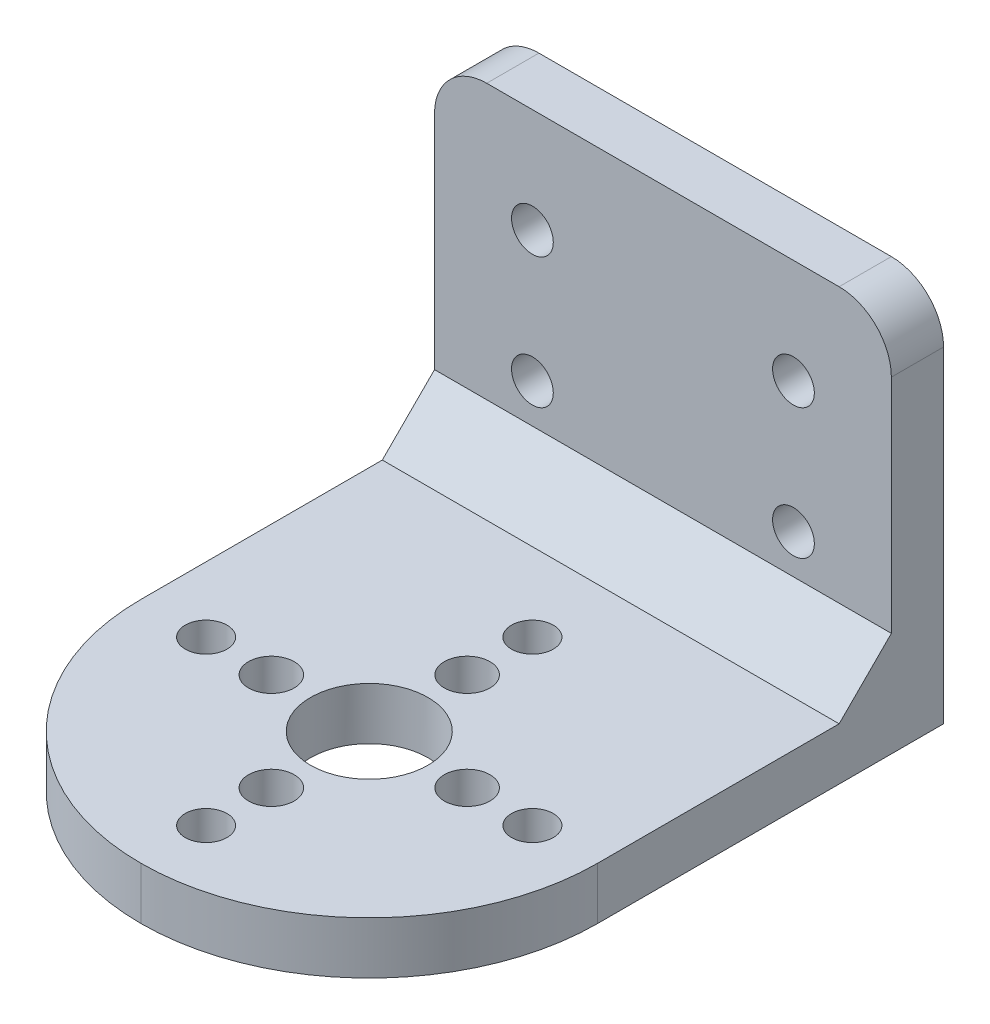
ISO-10303-21;
HEADER;
FILE_DESCRIPTION(('STEP AP214'),'2;1');
FILE_NAME('part.step','',(''),(''),'','','');
FILE_SCHEMA(('AUTOMOTIVE_DESIGN { 1 0 10303 214 1 1 1 1 }'));
ENDSEC;
DATA;
#1=APPLICATION_CONTEXT('core data for automotive mechanical design processes');
#2=APPLICATION_PROTOCOL_DEFINITION('international standard','automotive_design',2000,#1);
#3=PRODUCT_CONTEXT('',#1,'mechanical');
#4=PRODUCT('Part','Part','',(#3));
#5=PRODUCT_RELATED_PRODUCT_CATEGORY('part','',(#4));
#6=PRODUCT_DEFINITION_FORMATION('','',#4);
#7=PRODUCT_DEFINITION_CONTEXT('part definition',#1,'design');
#8=PRODUCT_DEFINITION('design','',#6,#7);
#9=PRODUCT_DEFINITION_SHAPE('','',#8);
#10=(LENGTH_UNIT() NAMED_UNIT(*) SI_UNIT(.MILLI.,.METRE.));
#11=(NAMED_UNIT(*) PLANE_ANGLE_UNIT() SI_UNIT($,.RADIAN.));
#12=(NAMED_UNIT(*) SI_UNIT($,.STERADIAN.) SOLID_ANGLE_UNIT());
#13=UNCERTAINTY_MEASURE_WITH_UNIT(LENGTH_MEASURE(1.E-05),#10,'distance_accuracy_value','');
#14=(GEOMETRIC_REPRESENTATION_CONTEXT(3) GLOBAL_UNCERTAINTY_ASSIGNED_CONTEXT((#13)) GLOBAL_UNIT_ASSIGNED_CONTEXT((#10,
#11,#12)) REPRESENTATION_CONTEXT('',''));
#15=CARTESIAN_POINT('',(0.,0.,0.));
#16=DIRECTION('',(0.,0.,1.));
#17=DIRECTION('',(1.,0.,0.));
#18=AXIS2_PLACEMENT_3D('',#15,#16,#17);
#19=CARTESIAN_POINT('',(0.,4.,0.));
#20=DIRECTION('',(0.,-1.,0.));
#21=DIRECTION('',(0.,0.,-1.));
#22=AXIS2_PLACEMENT_3D('',#19,#20,#21);
#23=PLANE('',#22);
#24=CARTESIAN_POINT('',(17.5,4.,-10.));
#25=DIRECTION('',(0.,1.,0.));
#26=DIRECTION('',(0.,0.,1.));
#27=AXIS2_PLACEMENT_3D('',#24,#25,#26);
#28=CIRCLE('',#27,1.75);
#29=CARTESIAN_POINT('',(17.5,4.,-8.25));
#30=VERTEX_POINT('',#29);
#31=EDGE_CURVE('E348',#30,#30,#28,.T.);
#32=ORIENTED_EDGE('',*,*,#31,.F.);
#33=EDGE_LOOP('',(#32));
#34=FACE_BOUND('',#33,.T.);
#35=CARTESIAN_POINT('',(10.,4.,-17.5));
#36=DIRECTION('',(0.,1.,0.));
#37=DIRECTION('',(0.,0.,1.));
#38=AXIS2_PLACEMENT_3D('',#35,#36,#37);
#39=CIRCLE('',#38,1.75);
#40=CARTESIAN_POINT('',(10.,4.,-15.75));
#41=VERTEX_POINT('',#40);
#42=EDGE_CURVE('E344',#41,#41,#39,.T.);
#43=ORIENTED_EDGE('',*,*,#42,.F.);
#44=EDGE_LOOP('',(#43));
#45=FACE_BOUND('',#44,.T.);
#46=CARTESIAN_POINT('',(25.,4.,-17.5));
#47=DIRECTION('',(0.,1.,0.));
#48=DIRECTION('',(0.,0.,1.));
#49=AXIS2_PLACEMENT_3D('',#46,#47,#48);
#50=CIRCLE('',#49,1.75);
#51=CARTESIAN_POINT('',(25.,4.,-15.75));
#52=VERTEX_POINT('',#51);
#53=EDGE_CURVE('E340',#52,#52,#50,.T.);
#54=ORIENTED_EDGE('',*,*,#53,.F.);
#55=EDGE_LOOP('',(#54));
#56=FACE_BOUND('',#55,.T.);
#57=CARTESIAN_POINT('',(17.5,4.,-25.));
#58=DIRECTION('',(0.,1.,0.));
#59=DIRECTION('',(0.,0.,1.));
#60=AXIS2_PLACEMENT_3D('',#57,#58,#59);
#61=CIRCLE('',#60,1.75);
#62=CARTESIAN_POINT('',(17.5,4.,-23.25));
#63=VERTEX_POINT('',#62);
#64=EDGE_CURVE('E339',#63,#63,#61,.T.);
#65=ORIENTED_EDGE('',*,*,#64,.F.);
#66=EDGE_LOOP('',(#65));
#67=FACE_BOUND('',#66,.T.);
#68=CARTESIAN_POINT('',(5.,4.,-17.5));
#69=DIRECTION('',(0.,1.,0.));
#70=DIRECTION('',(0.,0.,1.));
#71=AXIS2_PLACEMENT_3D('',#68,#69,#70);
#72=CIRCLE('',#71,1.6);
#73=CARTESIAN_POINT('',(5.,4.,-15.9));
#74=VERTEX_POINT('',#73);
#75=EDGE_CURVE('E364',#74,#74,#72,.T.);
#76=ORIENTED_EDGE('',*,*,#75,.F.);
#77=EDGE_LOOP('',(#76));
#78=FACE_BOUND('',#77,.T.);
#79=CARTESIAN_POINT('',(17.5,4.,-5.));
#80=DIRECTION('',(0.,1.,0.));
#81=DIRECTION('',(0.,0.,1.));
#82=AXIS2_PLACEMENT_3D('',#79,#80,#81);
#83=CIRCLE('',#82,1.6);
#84=CARTESIAN_POINT('',(17.5,4.,-3.4));
#85=VERTEX_POINT('',#84);
#86=EDGE_CURVE('E360',#85,#85,#83,.T.);
#87=ORIENTED_EDGE('',*,*,#86,.F.);
#88=EDGE_LOOP('',(#87));
#89=FACE_BOUND('',#88,.T.);
#90=CARTESIAN_POINT('',(30.,4.,-17.5));
#91=DIRECTION('',(0.,1.,0.));
#92=DIRECTION('',(0.,0.,1.));
#93=AXIS2_PLACEMENT_3D('',#90,#91,#92);
#94=CIRCLE('',#93,1.6);
#95=CARTESIAN_POINT('',(30.,4.,-15.9));
#96=VERTEX_POINT('',#95);
#97=EDGE_CURVE('E356',#96,#96,#94,.T.);
#98=ORIENTED_EDGE('',*,*,#97,.F.);
#99=EDGE_LOOP('',(#98));
#100=FACE_BOUND('',#99,.T.);
#101=CARTESIAN_POINT('',(17.5,4.,-30.));
#102=DIRECTION('',(0.,1.,0.));
#103=DIRECTION('',(0.,0.,1.));
#104=AXIS2_PLACEMENT_3D('',#101,#102,#103);
#105=CIRCLE('',#104,1.6);
#106=CARTESIAN_POINT('',(17.5,4.,-28.4));
#107=VERTEX_POINT('',#106);
#108=EDGE_CURVE('E352',#107,#107,#105,.T.);
#109=ORIENTED_EDGE('',*,*,#108,.F.);
#110=EDGE_LOOP('',(#109));
#111=FACE_BOUND('',#110,.T.);
#112=CARTESIAN_POINT('',(17.5,4.,-17.5));
#113=DIRECTION('',(0.,1.,0.));
#114=DIRECTION('',(0.,0.,1.));
#115=AXIS2_PLACEMENT_3D('',#112,#113,#114);
#116=CIRCLE('',#115,4.5);
#117=CARTESIAN_POINT('',(17.5,4.,-13.));
#118=VERTEX_POINT('',#117);
#119=EDGE_CURVE('E166',#118,#118,#116,.T.);
#120=ORIENTED_EDGE('',*,*,#119,.F.);
#121=EDGE_LOOP('',(#120));
#122=FACE_BOUND('',#121,.T.);
#123=CARTESIAN_POINT('',(17.5,4.,-17.5));
#124=DIRECTION('',(0.,-1.,0.));
#125=DIRECTION('',(0.,0.,-1.));
#126=AXIS2_PLACEMENT_3D('',#123,#124,#125);
#127=CIRCLE('',#126,17.5);
#128=CARTESIAN_POINT('',(0.,4.,-17.5));
#129=VERTEX_POINT('',#128);
#130=CARTESIAN_POINT('',(17.5,4.,0.));
#131=VERTEX_POINT('',#130);
#132=EDGE_CURVE('E221',#129,#131,#127,.F.);
#133=ORIENTED_EDGE('',*,*,#132,.T.);
#134=CARTESIAN_POINT('',(17.5,4.,-17.5));
#135=DIRECTION('',(0.,-1.,0.));
#136=DIRECTION('',(0.,0.,-1.));
#137=AXIS2_PLACEMENT_3D('',#134,#135,#136);
#138=CIRCLE('',#137,17.5);
#139=CARTESIAN_POINT('',(35.,4.,-17.5));
#140=VERTEX_POINT('',#139);
#141=EDGE_CURVE('E224',#131,#140,#138,.F.);
#142=ORIENTED_EDGE('',*,*,#141,.T.);
#143=DIRECTION('',(0.,0.,-1.));
#144=VECTOR('',#143,1.);
#145=CARTESIAN_POINT('',(35.,4.,0.));
#146=LINE('',#145,#144);
#147=CARTESIAN_POINT('',(35.,4.,-36.));
#148=VERTEX_POINT('',#147);
#149=EDGE_CURVE('E155',#140,#148,#146,.T.);
#150=ORIENTED_EDGE('',*,*,#149,.T.);
#151=DIRECTION('',(-1.,0.,0.));
#152=VECTOR('',#151,1.);
#153=CARTESIAN_POINT('',(0.,4.,-36.));
#154=LINE('',#153,#152);
#155=CARTESIAN_POINT('',(0.,4.,-36.));
#156=VERTEX_POINT('',#155);
#157=EDGE_CURVE('E202',#148,#156,#154,.T.);
#158=ORIENTED_EDGE('',*,*,#157,.T.);
#159=DIRECTION('',(0.,0.,1.));
#160=VECTOR('',#159,1.);
#161=CARTESIAN_POINT('',(0.,4.,0.));
#162=LINE('',#161,#160);
#163=EDGE_CURVE('E151',#156,#129,#162,.T.);
#164=ORIENTED_EDGE('',*,*,#163,.T.);
#165=EDGE_LOOP('',(#133,#142,#150,#158,#164));
#166=FACE_BOUND('',#165,.T.);
#167=ADVANCED_FACE('F47',(#34,#45,#56,#67,#78,#89,#100,#111,#122,#166),#23,.F.);
#168=CARTESIAN_POINT('',(0.,4.,0.));
#169=DIRECTION('',(1.,0.,0.));
#170=DIRECTION('',(0.,0.,-1.));
#171=AXIS2_PLACEMENT_3D('',#168,#169,#170);
#172=PLANE('',#171);
#173=DIRECTION('',(0.,-1.,0.));
#174=VECTOR('',#173,1.);
#175=CARTESIAN_POINT('',(0.,29.,-40.));
#176=LINE('',#175,#174);
#177=CARTESIAN_POINT('',(0.,25.,-40.));
#178=VERTEX_POINT('',#177);
#179=CARTESIAN_POINT('',(0.,8.00000000000003,-40.));
#180=VERTEX_POINT('',#179);
#181=EDGE_CURVE('E329',#178,#180,#176,.T.);
#182=ORIENTED_EDGE('',*,*,#181,.F.);
#183=DIRECTION('',(0.,0.,1.));
#184=VECTOR('',#183,1.);
#185=CARTESIAN_POINT('',(0.,25.,-44.));
#186=LINE('',#185,#184);
#187=CARTESIAN_POINT('',(0.,25.,-44.));
#188=VERTEX_POINT('',#187);
#189=EDGE_CURVE('E11',#178,#188,#186,.F.);
#190=ORIENTED_EDGE('',*,*,#189,.T.);
#191=DIRECTION('',(0.,-1.,0.));
#192=VECTOR('',#191,1.);
#193=CARTESIAN_POINT('',(0.,4.,-44.));
#194=LINE('',#193,#192);
#195=CARTESIAN_POINT('',(0.,0.,-44.));
#196=VERTEX_POINT('',#195);
#197=EDGE_CURVE('E135',#188,#196,#194,.T.);
#198=ORIENTED_EDGE('',*,*,#197,.T.);
#199=DIRECTION('',(0.,0.,1.));
#200=VECTOR('',#199,1.);
#201=CARTESIAN_POINT('',(0.,0.,0.));
#202=LINE('',#201,#200);
#203=CARTESIAN_POINT('',(0.,0.,-17.5));
#204=VERTEX_POINT('',#203);
#205=EDGE_CURVE('E146',#196,#204,#202,.T.);
#206=ORIENTED_EDGE('',*,*,#205,.T.);
#207=DIRECTION('',(0.,-1.,0.));
#208=VECTOR('',#207,1.);
#209=CARTESIAN_POINT('',(0.,4.,-17.5));
#210=LINE('',#209,#208);
#211=EDGE_CURVE('E227',#204,#129,#210,.F.);
#212=ORIENTED_EDGE('',*,*,#211,.T.);
#213=ORIENTED_EDGE('',*,*,#163,.F.);
#214=DIRECTION('',(0.,-0.707106781186551,0.707106781186544));
#215=VECTOR('',#214,1.);
#216=CARTESIAN_POINT('',(0.,-14.,-18.0000000000002));
#217=LINE('',#216,#215);
#218=EDGE_CURVE('E209',#156,#180,#217,.F.);
#219=ORIENTED_EDGE('',*,*,#218,.T.);
#220=EDGE_LOOP('',(#182,#190,#198,#206,#212,#213,#219));
#221=FACE_BOUND('',#220,.T.);
#222=ADVANCED_FACE('F279',(#221),#172,.F.);
#223=CARTESIAN_POINT('',(35.,4.,0.));
#224=DIRECTION('',(-1.,0.,0.));
#225=DIRECTION('',(0.,0.,1.));
#226=AXIS2_PLACEMENT_3D('',#223,#224,#225);
#227=PLANE('',#226);
#228=DIRECTION('',(0.,-1.,0.));
#229=VECTOR('',#228,1.);
#230=CARTESIAN_POINT('',(35.,4.,-44.));
#231=LINE('',#230,#229);
#232=CARTESIAN_POINT('',(35.,25.,-44.));
#233=VERTEX_POINT('',#232);
#234=CARTESIAN_POINT('',(35.,0.,-44.));
#235=VERTEX_POINT('',#234);
#236=EDGE_CURVE('E124',#233,#235,#231,.T.);
#237=ORIENTED_EDGE('',*,*,#236,.F.);
#238=DIRECTION('',(0.,0.,-1.));
#239=VECTOR('',#238,1.);
#240=CARTESIAN_POINT('',(35.,25.,-40.));
#241=LINE('',#240,#239);
#242=CARTESIAN_POINT('',(35.,25.,-40.));
#243=VERTEX_POINT('',#242);
#244=EDGE_CURVE('E71',#233,#243,#241,.F.);
#245=ORIENTED_EDGE('',*,*,#244,.T.);
#246=DIRECTION('',(0.,-1.,0.));
#247=VECTOR('',#246,1.);
#248=CARTESIAN_POINT('',(35.,29.,-40.));
#249=LINE('',#248,#247);
#250=CARTESIAN_POINT('',(35.,8.00000000000003,-40.));
#251=VERTEX_POINT('',#250);
#252=EDGE_CURVE('E255',#243,#251,#249,.T.);
#253=ORIENTED_EDGE('',*,*,#252,.T.);
#254=DIRECTION('',(0.,0.707106781186551,-0.707106781186544));
#255=VECTOR('',#254,1.);
#256=CARTESIAN_POINT('',(35.,-14.,-18.0000000000002));
#257=LINE('',#256,#255);
#258=EDGE_CURVE('E205',#251,#148,#257,.F.);
#259=ORIENTED_EDGE('',*,*,#258,.T.);
#260=ORIENTED_EDGE('',*,*,#149,.F.);
#261=DIRECTION('',(0.,-1.,0.));
#262=VECTOR('',#261,1.);
#263=CARTESIAN_POINT('',(35.,4.,-17.5));
#264=LINE('',#263,#262);
#265=CARTESIAN_POINT('',(35.,0.,-17.5));
#266=VERTEX_POINT('',#265);
#267=EDGE_CURVE('E143',#140,#266,#264,.T.);
#268=ORIENTED_EDGE('',*,*,#267,.T.);
#269=DIRECTION('',(0.,0.,-1.));
#270=VECTOR('',#269,1.);
#271=CARTESIAN_POINT('',(35.,0.,0.));
#272=LINE('',#271,#270);
#273=EDGE_CURVE('E139',#266,#235,#272,.T.);
#274=ORIENTED_EDGE('',*,*,#273,.T.);
#275=EDGE_LOOP('',(#237,#245,#253,#259,#260,#268,#274));
#276=FACE_BOUND('',#275,.T.);
#277=ADVANCED_FACE('F140',(#276),#227,.F.);
#278=CARTESIAN_POINT('',(0.,4.,-44.));
#279=DIRECTION('',(0.,0.,1.));
#280=DIRECTION('',(1.,0.,0.));
#281=AXIS2_PLACEMENT_3D('',#278,#279,#280);
#282=PLANE('',#281);
#283=CARTESIAN_POINT('',(7.5,11.,-44.));
#284=DIRECTION('',(0.,0.,1.));
#285=DIRECTION('',(1.,0.,0.));
#286=AXIS2_PLACEMENT_3D('',#283,#284,#285);
#287=CIRCLE('',#286,1.6);
#288=CARTESIAN_POINT('',(9.1,11.,-44.));
#289=VERTEX_POINT('',#288);
#290=EDGE_CURVE('E368',#289,#289,#287,.T.);
#291=ORIENTED_EDGE('',*,*,#290,.T.);
#292=EDGE_LOOP('',(#291));
#293=FACE_BOUND('',#292,.T.);
#294=CARTESIAN_POINT('',(27.5,11.,-44.));
#295=DIRECTION('',(0.,0.,1.));
#296=DIRECTION('',(1.,0.,0.));
#297=AXIS2_PLACEMENT_3D('',#294,#295,#296);
#298=CIRCLE('',#297,1.6);
#299=CARTESIAN_POINT('',(29.1,11.,-44.));
#300=VERTEX_POINT('',#299);
#301=EDGE_CURVE('E375',#300,#300,#298,.T.);
#302=ORIENTED_EDGE('',*,*,#301,.T.);
#303=EDGE_LOOP('',(#302));
#304=FACE_BOUND('',#303,.T.);
#305=CARTESIAN_POINT('',(27.5,21.,-44.));
#306=DIRECTION('',(0.,0.,1.));
#307=DIRECTION('',(1.,0.,0.));
#308=AXIS2_PLACEMENT_3D('',#305,#306,#307);
#309=CIRCLE('',#308,1.6);
#310=CARTESIAN_POINT('',(29.1,21.,-44.));
#311=VERTEX_POINT('',#310);
#312=EDGE_CURVE('E379',#311,#311,#309,.T.);
#313=ORIENTED_EDGE('',*,*,#312,.T.);
#314=EDGE_LOOP('',(#313));
#315=FACE_BOUND('',#314,.T.);
#316=CARTESIAN_POINT('',(7.5,21.,-44.));
#317=DIRECTION('',(0.,0.,1.));
#318=DIRECTION('',(1.,0.,0.));
#319=AXIS2_PLACEMENT_3D('',#316,#317,#318);
#320=CIRCLE('',#319,1.6);
#321=CARTESIAN_POINT('',(9.1,21.,-44.));
#322=VERTEX_POINT('',#321);
#323=EDGE_CURVE('E383',#322,#322,#320,.T.);
#324=ORIENTED_EDGE('',*,*,#323,.T.);
#325=EDGE_LOOP('',(#324));
#326=FACE_BOUND('',#325,.T.);
#327=DIRECTION('',(-1.,0.,0.));
#328=VECTOR('',#327,1.);
#329=CARTESIAN_POINT('',(0.,29.,-44.));
#330=LINE('',#329,#328);
#331=CARTESIAN_POINT('',(31.,29.,-44.));
#332=VERTEX_POINT('',#331);
#333=CARTESIAN_POINT('',(4.,29.,-44.));
#334=VERTEX_POINT('',#333);
#335=EDGE_CURVE('E263',#332,#334,#330,.T.);
#336=ORIENTED_EDGE('',*,*,#335,.F.);
#337=CARTESIAN_POINT('',(31.,25.,-44.));
#338=DIRECTION('',(0.,0.,1.));
#339=DIRECTION('',(1.,0.,0.));
#340=AXIS2_PLACEMENT_3D('',#337,#338,#339);
#341=CIRCLE('',#340,4.);
#342=EDGE_CURVE('E132',#332,#233,#341,.F.);
#343=ORIENTED_EDGE('',*,*,#342,.T.);
#344=ORIENTED_EDGE('',*,*,#236,.T.);
#345=DIRECTION('',(-1.,0.,0.));
#346=VECTOR('',#345,1.);
#347=CARTESIAN_POINT('',(0.,0.,-44.));
#348=LINE('',#347,#346);
#349=EDGE_CURVE('E130',#235,#196,#348,.T.);
#350=ORIENTED_EDGE('',*,*,#349,.T.);
#351=ORIENTED_EDGE('',*,*,#197,.F.);
#352=CARTESIAN_POINT('',(4.,25.,-44.));
#353=DIRECTION('',(0.,0.,1.));
#354=DIRECTION('',(1.,0.,0.));
#355=AXIS2_PLACEMENT_3D('',#352,#353,#354);
#356=CIRCLE('',#355,4.);
#357=EDGE_CURVE('E243',#188,#334,#356,.F.);
#358=ORIENTED_EDGE('',*,*,#357,.T.);
#359=EDGE_LOOP('',(#336,#343,#344,#350,#351,#358));
#360=FACE_BOUND('',#359,.T.);
#361=ADVANCED_FACE('F127',(#293,#304,#315,#326,#360),#282,.F.);
#362=CARTESIAN_POINT('',(0.,0.,0.));
#363=DIRECTION('',(0.,-1.,0.));
#364=DIRECTION('',(0.,0.,-1.));
#365=AXIS2_PLACEMENT_3D('',#362,#363,#364);
#366=PLANE('',#365);
#367=CARTESIAN_POINT('',(17.5,0.,-10.));
#368=DIRECTION('',(0.,-1.,0.));
#369=DIRECTION('',(0.,0.,-1.));
#370=AXIS2_PLACEMENT_3D('',#367,#368,#369);
#371=CIRCLE('',#370,1.75);
#372=CARTESIAN_POINT('',(17.5,0.,-11.75));
#373=VERTEX_POINT('',#372);
#374=EDGE_CURVE('E194',#373,#373,#371,.T.);
#375=ORIENTED_EDGE('',*,*,#374,.F.);
#376=EDGE_LOOP('',(#375));
#377=FACE_BOUND('',#376,.T.);
#378=CARTESIAN_POINT('',(10.,0.,-17.5));
#379=DIRECTION('',(0.,-1.,0.));
#380=DIRECTION('',(0.,0.,-1.));
#381=AXIS2_PLACEMENT_3D('',#378,#379,#380);
#382=CIRCLE('',#381,1.75);
#383=CARTESIAN_POINT('',(10.,0.,-19.25));
#384=VERTEX_POINT('',#383);
#385=EDGE_CURVE('E190',#384,#384,#382,.T.);
#386=ORIENTED_EDGE('',*,*,#385,.F.);
#387=EDGE_LOOP('',(#386));
#388=FACE_BOUND('',#387,.T.);
#389=CARTESIAN_POINT('',(25.,0.,-17.5));
#390=DIRECTION('',(0.,-1.,0.));
#391=DIRECTION('',(0.,0.,-1.));
#392=AXIS2_PLACEMENT_3D('',#389,#390,#391);
#393=CIRCLE('',#392,1.75);
#394=CARTESIAN_POINT('',(25.,0.,-19.25));
#395=VERTEX_POINT('',#394);
#396=EDGE_CURVE('E186',#395,#395,#393,.T.);
#397=ORIENTED_EDGE('',*,*,#396,.F.);
#398=EDGE_LOOP('',(#397));
#399=FACE_BOUND('',#398,.T.);
#400=CARTESIAN_POINT('',(17.5,0.,-25.));
#401=DIRECTION('',(0.,-1.,0.));
#402=DIRECTION('',(0.,0.,-1.));
#403=AXIS2_PLACEMENT_3D('',#400,#401,#402);
#404=CIRCLE('',#403,1.75);
#405=CARTESIAN_POINT('',(17.5,0.,-26.75));
#406=VERTEX_POINT('',#405);
#407=EDGE_CURVE('E182',#406,#406,#404,.T.);
#408=ORIENTED_EDGE('',*,*,#407,.F.);
#409=EDGE_LOOP('',(#408));
#410=FACE_BOUND('',#409,.T.);
#411=CARTESIAN_POINT('',(5.,0.,-17.5));
#412=DIRECTION('',(0.,-1.,0.));
#413=DIRECTION('',(0.,0.,-1.));
#414=AXIS2_PLACEMENT_3D('',#411,#412,#413);
#415=CIRCLE('',#414,1.6);
#416=CARTESIAN_POINT('',(5.,0.,-19.1));
#417=VERTEX_POINT('',#416);
#418=EDGE_CURVE('E178',#417,#417,#415,.T.);
#419=ORIENTED_EDGE('',*,*,#418,.F.);
#420=EDGE_LOOP('',(#419));
#421=FACE_BOUND('',#420,.T.);
#422=CARTESIAN_POINT('',(17.5,0.,-5.));
#423=DIRECTION('',(0.,-1.,0.));
#424=DIRECTION('',(0.,0.,-1.));
#425=AXIS2_PLACEMENT_3D('',#422,#423,#424);
#426=CIRCLE('',#425,1.6);
#427=CARTESIAN_POINT('',(17.5,0.,-6.6));
#428=VERTEX_POINT('',#427);
#429=EDGE_CURVE('E174',#428,#428,#426,.T.);
#430=ORIENTED_EDGE('',*,*,#429,.F.);
#431=EDGE_LOOP('',(#430));
#432=FACE_BOUND('',#431,.T.);
#433=CARTESIAN_POINT('',(30.,0.,-17.5));
#434=DIRECTION('',(0.,-1.,0.));
#435=DIRECTION('',(0.,0.,-1.));
#436=AXIS2_PLACEMENT_3D('',#433,#434,#435);
#437=CIRCLE('',#436,1.6);
#438=CARTESIAN_POINT('',(30.,0.,-19.1));
#439=VERTEX_POINT('',#438);
#440=EDGE_CURVE('E170',#439,#439,#437,.T.);
#441=ORIENTED_EDGE('',*,*,#440,.F.);
#442=EDGE_LOOP('',(#441));
#443=FACE_BOUND('',#442,.T.);
#444=CARTESIAN_POINT('',(17.5,0.,-30.));
#445=DIRECTION('',(0.,-1.,0.));
#446=DIRECTION('',(0.,0.,-1.));
#447=AXIS2_PLACEMENT_3D('',#444,#445,#446);
#448=CIRCLE('',#447,1.6);
#449=CARTESIAN_POINT('',(17.5,0.,-31.6));
#450=VERTEX_POINT('',#449);
#451=EDGE_CURVE('E165',#450,#450,#448,.T.);
#452=ORIENTED_EDGE('',*,*,#451,.F.);
#453=EDGE_LOOP('',(#452));
#454=FACE_BOUND('',#453,.T.);
#455=CARTESIAN_POINT('',(17.5,0.,-17.5));
#456=DIRECTION('',(0.,-1.,0.));
#457=DIRECTION('',(0.,0.,-1.));
#458=AXIS2_PLACEMENT_3D('',#455,#456,#457);
#459=CIRCLE('',#458,4.5);
#460=CARTESIAN_POINT('',(17.5,0.,-22.));
#461=VERTEX_POINT('',#460);
#462=EDGE_CURVE('E161',#461,#461,#459,.T.);
#463=ORIENTED_EDGE('',*,*,#462,.F.);
#464=EDGE_LOOP('',(#463));
#465=FACE_BOUND('',#464,.T.);
#466=ORIENTED_EDGE('',*,*,#273,.F.);
#467=CARTESIAN_POINT('',(17.5,0.,-17.5));
#468=DIRECTION('',(0.,-1.,0.));
#469=DIRECTION('',(0.,0.,-1.));
#470=AXIS2_PLACEMENT_3D('',#467,#468,#469);
#471=CIRCLE('',#470,17.5);
#472=CARTESIAN_POINT('',(17.5,0.,0.));
#473=VERTEX_POINT('',#472);
#474=EDGE_CURVE('E218',#266,#473,#471,.T.);
#475=ORIENTED_EDGE('',*,*,#474,.T.);
#476=CARTESIAN_POINT('',(17.5,0.,-17.5));
#477=DIRECTION('',(0.,-1.,0.));
#478=DIRECTION('',(0.,0.,-1.));
#479=AXIS2_PLACEMENT_3D('',#476,#477,#478);
#480=CIRCLE('',#479,17.5);
#481=EDGE_CURVE('E215',#473,#204,#480,.T.);
#482=ORIENTED_EDGE('',*,*,#481,.T.);
#483=ORIENTED_EDGE('',*,*,#205,.F.);
#484=ORIENTED_EDGE('',*,*,#349,.F.);
#485=EDGE_LOOP('',(#466,#475,#482,#483,#484));
#486=FACE_BOUND('',#485,.T.);
#487=ADVANCED_FACE('F148',(#377,#388,#399,#410,#421,#432,#443,#454,#465,#486),#366,.T.);
#488=CARTESIAN_POINT('',(0.,29.,-40.));
#489=DIRECTION('',(0.,0.,-1.));
#490=DIRECTION('',(-1.,0.,0.));
#491=AXIS2_PLACEMENT_3D('',#488,#489,#490);
#492=PLANE('',#491);
#493=CARTESIAN_POINT('',(7.5,11.,-40.));
#494=DIRECTION('',(0.,0.,1.));
#495=DIRECTION('',(1.,0.,0.));
#496=AXIS2_PLACEMENT_3D('',#493,#494,#495);
#497=CIRCLE('',#496,1.6);
#498=CARTESIAN_POINT('',(9.1,11.,-40.));
#499=VERTEX_POINT('',#498);
#500=EDGE_CURVE('E235',#499,#499,#497,.T.);
#501=ORIENTED_EDGE('',*,*,#500,.F.);
#502=EDGE_LOOP('',(#501));
#503=FACE_BOUND('',#502,.T.);
#504=CARTESIAN_POINT('',(27.5,11.,-40.));
#505=DIRECTION('',(0.,0.,1.));
#506=DIRECTION('',(1.,0.,0.));
#507=AXIS2_PLACEMENT_3D('',#504,#505,#506);
#508=CIRCLE('',#507,1.6);
#509=CARTESIAN_POINT('',(29.1,11.,-40.));
#510=VERTEX_POINT('',#509);
#511=EDGE_CURVE('E395',#510,#510,#508,.T.);
#512=ORIENTED_EDGE('',*,*,#511,.F.);
#513=EDGE_LOOP('',(#512));
#514=FACE_BOUND('',#513,.T.);
#515=CARTESIAN_POINT('',(27.5,21.,-40.));
#516=DIRECTION('',(0.,0.,1.));
#517=DIRECTION('',(1.,0.,0.));
#518=AXIS2_PLACEMENT_3D('',#515,#516,#517);
#519=CIRCLE('',#518,1.6);
#520=CARTESIAN_POINT('',(29.1,21.,-40.));
#521=VERTEX_POINT('',#520);
#522=EDGE_CURVE('E391',#521,#521,#519,.T.);
#523=ORIENTED_EDGE('',*,*,#522,.F.);
#524=EDGE_LOOP('',(#523));
#525=FACE_BOUND('',#524,.T.);
#526=CARTESIAN_POINT('',(7.5,21.,-40.));
#527=DIRECTION('',(0.,0.,1.));
#528=DIRECTION('',(1.,0.,0.));
#529=AXIS2_PLACEMENT_3D('',#526,#527,#528);
#530=CIRCLE('',#529,1.6);
#531=CARTESIAN_POINT('',(9.1,21.,-40.));
#532=VERTEX_POINT('',#531);
#533=EDGE_CURVE('E387',#532,#532,#530,.T.);
#534=ORIENTED_EDGE('',*,*,#533,.F.);
#535=EDGE_LOOP('',(#534));
#536=FACE_BOUND('',#535,.T.);
#537=ORIENTED_EDGE('',*,*,#252,.F.);
#538=CARTESIAN_POINT('',(31.,25.,-40.));
#539=DIRECTION('',(0.,0.,-1.));
#540=DIRECTION('',(-1.,0.,0.));
#541=AXIS2_PLACEMENT_3D('',#538,#539,#540);
#542=CIRCLE('',#541,4.);
#543=CARTESIAN_POINT('',(31.,29.,-40.));
#544=VERTEX_POINT('',#543);
#545=EDGE_CURVE('E56',#243,#544,#542,.F.);
#546=ORIENTED_EDGE('',*,*,#545,.T.);
#547=DIRECTION('',(1.,0.,0.));
#548=VECTOR('',#547,1.);
#549=CARTESIAN_POINT('',(0.,29.,-40.));
#550=LINE('',#549,#548);
#551=CARTESIAN_POINT('',(4.,29.,-40.));
#552=VERTEX_POINT('',#551);
#553=EDGE_CURVE('E198',#552,#544,#550,.T.);
#554=ORIENTED_EDGE('',*,*,#553,.F.);
#555=CARTESIAN_POINT('',(4.,25.,-40.));
#556=DIRECTION('',(0.,0.,-1.));
#557=DIRECTION('',(-1.,0.,0.));
#558=AXIS2_PLACEMENT_3D('',#555,#556,#557);
#559=CIRCLE('',#558,4.);
#560=EDGE_CURVE('E63',#552,#178,#559,.F.);
#561=ORIENTED_EDGE('',*,*,#560,.T.);
#562=ORIENTED_EDGE('',*,*,#181,.T.);
#563=DIRECTION('',(1.,0.,0.));
#564=VECTOR('',#563,1.);
#565=CARTESIAN_POINT('',(35.,8.00000000000003,-40.));
#566=LINE('',#565,#564);
#567=EDGE_CURVE('E134',#180,#251,#566,.T.);
#568=ORIENTED_EDGE('',*,*,#567,.T.);
#569=EDGE_LOOP('',(#537,#546,#554,#561,#562,#568));
#570=FACE_BOUND('',#569,.T.);
#571=ADVANCED_FACE('F254',(#503,#514,#525,#536,#570),#492,.F.);
#572=CARTESIAN_POINT('',(0.,29.,0.));
#573=DIRECTION('',(0.,1.,0.));
#574=DIRECTION('',(0.,0.,1.));
#575=AXIS2_PLACEMENT_3D('',#572,#573,#574);
#576=PLANE('',#575);
#577=ORIENTED_EDGE('',*,*,#553,.T.);
#578=DIRECTION('',(0.,0.,-1.));
#579=VECTOR('',#578,1.);
#580=CARTESIAN_POINT('',(31.,29.,-44.));
#581=LINE('',#580,#579);
#582=EDGE_CURVE('E239',#544,#332,#581,.T.);
#583=ORIENTED_EDGE('',*,*,#582,.T.);
#584=ORIENTED_EDGE('',*,*,#335,.T.);
#585=DIRECTION('',(0.,0.,1.));
#586=VECTOR('',#585,1.);
#587=CARTESIAN_POINT('',(4.,29.,-40.));
#588=LINE('',#587,#586);
#589=EDGE_CURVE('E230',#334,#552,#588,.T.);
#590=ORIENTED_EDGE('',*,*,#589,.T.);
#591=EDGE_LOOP('',(#577,#583,#584,#590));
#592=FACE_BOUND('',#591,.T.);
#593=ADVANCED_FACE('F259',(#592),#576,.T.);
#594=CARTESIAN_POINT('',(17.5,-16.,-17.5));
#595=DIRECTION('',(0.,1.,0.));
#596=DIRECTION('',(0.,0.,1.));
#597=AXIS2_PLACEMENT_3D('',#594,#595,#596);
#598=CYLINDRICAL_SURFACE('',#597,4.5);
#599=ORIENTED_EDGE('',*,*,#462,.T.);
#600=EDGE_LOOP('',(#599));
#601=FACE_BOUND('',#600,.T.);
#602=ORIENTED_EDGE('',*,*,#119,.T.);
#603=EDGE_LOOP('',(#602));
#604=FACE_BOUND('',#603,.T.);
#605=ADVANCED_FACE('F435',(#601,#604),#598,.F.);
#606=CARTESIAN_POINT('',(17.5,-16.,-30.));
#607=DIRECTION('',(0.,1.,0.));
#608=DIRECTION('',(0.,0.,1.));
#609=AXIS2_PLACEMENT_3D('',#606,#607,#608);
#610=CYLINDRICAL_SURFACE('',#609,1.6);
#611=ORIENTED_EDGE('',*,*,#451,.T.);
#612=EDGE_LOOP('',(#611));
#613=FACE_BOUND('',#612,.T.);
#614=ORIENTED_EDGE('',*,*,#108,.T.);
#615=EDGE_LOOP('',(#614));
#616=FACE_BOUND('',#615,.T.);
#617=ADVANCED_FACE('F432',(#613,#616),#610,.F.);
#618=CARTESIAN_POINT('',(30.,-16.,-17.5));
#619=DIRECTION('',(0.,1.,0.));
#620=DIRECTION('',(0.,0.,1.));
#621=AXIS2_PLACEMENT_3D('',#618,#619,#620);
#622=CYLINDRICAL_SURFACE('',#621,1.6);
#623=ORIENTED_EDGE('',*,*,#440,.T.);
#624=EDGE_LOOP('',(#623));
#625=FACE_BOUND('',#624,.T.);
#626=ORIENTED_EDGE('',*,*,#97,.T.);
#627=EDGE_LOOP('',(#626));
#628=FACE_BOUND('',#627,.T.);
#629=ADVANCED_FACE('F426',(#625,#628),#622,.F.);
#630=CARTESIAN_POINT('',(17.5,-16.,-5.));
#631=DIRECTION('',(0.,1.,0.));
#632=DIRECTION('',(0.,0.,1.));
#633=AXIS2_PLACEMENT_3D('',#630,#631,#632);
#634=CYLINDRICAL_SURFACE('',#633,1.6);
#635=ORIENTED_EDGE('',*,*,#429,.T.);
#636=EDGE_LOOP('',(#635));
#637=FACE_BOUND('',#636,.T.);
#638=ORIENTED_EDGE('',*,*,#86,.T.);
#639=EDGE_LOOP('',(#638));
#640=FACE_BOUND('',#639,.T.);
#641=ADVANCED_FACE('F422',(#637,#640),#634,.F.);
#642=CARTESIAN_POINT('',(5.,-16.,-17.5));
#643=DIRECTION('',(0.,1.,0.));
#644=DIRECTION('',(0.,0.,1.));
#645=AXIS2_PLACEMENT_3D('',#642,#643,#644);
#646=CYLINDRICAL_SURFACE('',#645,1.6);
#647=ORIENTED_EDGE('',*,*,#418,.T.);
#648=EDGE_LOOP('',(#647));
#649=FACE_BOUND('',#648,.T.);
#650=ORIENTED_EDGE('',*,*,#75,.T.);
#651=EDGE_LOOP('',(#650));
#652=FACE_BOUND('',#651,.T.);
#653=ADVANCED_FACE('F425',(#649,#652),#646,.F.);
#654=CARTESIAN_POINT('',(17.5,-16.,-25.));
#655=DIRECTION('',(0.,1.,0.));
#656=DIRECTION('',(0.,0.,1.));
#657=AXIS2_PLACEMENT_3D('',#654,#655,#656);
#658=CYLINDRICAL_SURFACE('',#657,1.75);
#659=ORIENTED_EDGE('',*,*,#407,.T.);
#660=EDGE_LOOP('',(#659));
#661=FACE_BOUND('',#660,.T.);
#662=ORIENTED_EDGE('',*,*,#64,.T.);
#663=EDGE_LOOP('',(#662));
#664=FACE_BOUND('',#663,.T.);
#665=ADVANCED_FACE('F430',(#661,#664),#658,.F.);
#666=CARTESIAN_POINT('',(25.,-16.,-17.5));
#667=DIRECTION('',(0.,1.,0.));
#668=DIRECTION('',(0.,0.,1.));
#669=AXIS2_PLACEMENT_3D('',#666,#667,#668);
#670=CYLINDRICAL_SURFACE('',#669,1.75);
#671=ORIENTED_EDGE('',*,*,#396,.T.);
#672=EDGE_LOOP('',(#671));
#673=FACE_BOUND('',#672,.T.);
#674=ORIENTED_EDGE('',*,*,#53,.T.);
#675=EDGE_LOOP('',(#674));
#676=FACE_BOUND('',#675,.T.);
#677=ADVANCED_FACE('F443',(#673,#676),#670,.F.);
#678=CARTESIAN_POINT('',(10.,-16.,-17.5));
#679=DIRECTION('',(0.,1.,0.));
#680=DIRECTION('',(0.,0.,1.));
#681=AXIS2_PLACEMENT_3D('',#678,#679,#680);
#682=CYLINDRICAL_SURFACE('',#681,1.75);
#683=ORIENTED_EDGE('',*,*,#385,.T.);
#684=EDGE_LOOP('',(#683));
#685=FACE_BOUND('',#684,.T.);
#686=ORIENTED_EDGE('',*,*,#42,.T.);
#687=EDGE_LOOP('',(#686));
#688=FACE_BOUND('',#687,.T.);
#689=ADVANCED_FACE('F440',(#685,#688),#682,.F.);
#690=CARTESIAN_POINT('',(17.5,-16.,-10.));
#691=DIRECTION('',(0.,1.,0.));
#692=DIRECTION('',(0.,0.,1.));
#693=AXIS2_PLACEMENT_3D('',#690,#691,#692);
#694=CYLINDRICAL_SURFACE('',#693,1.75);
#695=ORIENTED_EDGE('',*,*,#374,.T.);
#696=EDGE_LOOP('',(#695));
#697=FACE_BOUND('',#696,.T.);
#698=ORIENTED_EDGE('',*,*,#31,.T.);
#699=EDGE_LOOP('',(#698));
#700=FACE_BOUND('',#699,.T.);
#701=ADVANCED_FACE('F307',(#697,#700),#694,.F.);
#702=CARTESIAN_POINT('',(0.,8.00000000000003,-40.));
#703=DIRECTION('',(0.,0.707106781186544,0.707106781186551));
#704=DIRECTION('',(-1.,0.,0.));
#705=AXIS2_PLACEMENT_3D('',#702,#703,#704);
#706=PLANE('',#705);
#707=ORIENTED_EDGE('',*,*,#218,.F.);
#708=ORIENTED_EDGE('',*,*,#157,.F.);
#709=ORIENTED_EDGE('',*,*,#258,.F.);
#710=ORIENTED_EDGE('',*,*,#567,.F.);
#711=EDGE_LOOP('',(#707,#708,#709,#710));
#712=FACE_BOUND('',#711,.T.);
#713=ADVANCED_FACE('F302',(#712),#706,.T.);
#714=CARTESIAN_POINT('',(7.5,21.,-60.));
#715=DIRECTION('',(0.,0.,1.));
#716=DIRECTION('',(1.,0.,0.));
#717=AXIS2_PLACEMENT_3D('',#714,#715,#716);
#718=CYLINDRICAL_SURFACE('',#717,1.6);
#719=ORIENTED_EDGE('',*,*,#533,.T.);
#720=EDGE_LOOP('',(#719));
#721=FACE_BOUND('',#720,.T.);
#722=ORIENTED_EDGE('',*,*,#323,.F.);
#723=EDGE_LOOP('',(#722));
#724=FACE_BOUND('',#723,.T.);
#725=ADVANCED_FACE('F306',(#721,#724),#718,.F.);
#726=CARTESIAN_POINT('',(27.5,21.,-60.));
#727=DIRECTION('',(0.,0.,1.));
#728=DIRECTION('',(1.,0.,0.));
#729=AXIS2_PLACEMENT_3D('',#726,#727,#728);
#730=CYLINDRICAL_SURFACE('',#729,1.6);
#731=ORIENTED_EDGE('',*,*,#522,.T.);
#732=EDGE_LOOP('',(#731));
#733=FACE_BOUND('',#732,.T.);
#734=ORIENTED_EDGE('',*,*,#312,.F.);
#735=EDGE_LOOP('',(#734));
#736=FACE_BOUND('',#735,.T.);
#737=ADVANCED_FACE('F403',(#733,#736),#730,.F.);
#738=CARTESIAN_POINT('',(27.5,11.,-60.));
#739=DIRECTION('',(0.,0.,1.));
#740=DIRECTION('',(1.,0.,0.));
#741=AXIS2_PLACEMENT_3D('',#738,#739,#740);
#742=CYLINDRICAL_SURFACE('',#741,1.6);
#743=ORIENTED_EDGE('',*,*,#511,.T.);
#744=EDGE_LOOP('',(#743));
#745=FACE_BOUND('',#744,.T.);
#746=ORIENTED_EDGE('',*,*,#301,.F.);
#747=EDGE_LOOP('',(#746));
#748=FACE_BOUND('',#747,.T.);
#749=ADVANCED_FACE('F314',(#745,#748),#742,.F.);
#750=CARTESIAN_POINT('',(7.5,11.,-60.));
#751=DIRECTION('',(0.,0.,1.));
#752=DIRECTION('',(1.,0.,0.));
#753=AXIS2_PLACEMENT_3D('',#750,#751,#752);
#754=CYLINDRICAL_SURFACE('',#753,1.6);
#755=ORIENTED_EDGE('',*,*,#500,.T.);
#756=EDGE_LOOP('',(#755));
#757=FACE_BOUND('',#756,.T.);
#758=ORIENTED_EDGE('',*,*,#290,.F.);
#759=EDGE_LOOP('',(#758));
#760=FACE_BOUND('',#759,.T.);
#761=ADVANCED_FACE('F310',(#757,#760),#754,.F.);
#762=CARTESIAN_POINT('',(17.5,4.,-17.5));
#763=DIRECTION('',(0.,-1.,0.));
#764=DIRECTION('',(0.,0.,-1.));
#765=AXIS2_PLACEMENT_3D('',#762,#763,#764);
#766=CYLINDRICAL_SURFACE('',#765,17.5);
#767=DIRECTION('',(0.,-1.,0.));
#768=VECTOR('',#767,1.);
#769=CARTESIAN_POINT('',(17.5,4.,0.));
#770=LINE('',#769,#768);
#771=EDGE_CURVE('E231',#131,#473,#770,.T.);
#772=ORIENTED_EDGE('',*,*,#771,.F.);
#773=ORIENTED_EDGE('',*,*,#132,.F.);
#774=ORIENTED_EDGE('',*,*,#211,.F.);
#775=ORIENTED_EDGE('',*,*,#481,.F.);
#776=EDGE_LOOP('',(#772,#773,#774,#775));
#777=FACE_BOUND('',#776,.T.);
#778=ADVANCED_FACE('F274',(#777),#766,.T.);
#779=CARTESIAN_POINT('',(17.5,4.,-17.5));
#780=DIRECTION('',(0.,-1.,0.));
#781=DIRECTION('',(0.,0.,-1.));
#782=AXIS2_PLACEMENT_3D('',#779,#780,#781);
#783=CYLINDRICAL_SURFACE('',#782,17.5);
#784=ORIENTED_EDGE('',*,*,#141,.F.);
#785=ORIENTED_EDGE('',*,*,#771,.T.);
#786=ORIENTED_EDGE('',*,*,#474,.F.);
#787=ORIENTED_EDGE('',*,*,#267,.F.);
#788=EDGE_LOOP('',(#784,#785,#786,#787));
#789=FACE_BOUND('',#788,.T.);
#790=ADVANCED_FACE('F267',(#789),#783,.T.);
#791=CARTESIAN_POINT('',(31.,25.,0.));
#792=DIRECTION('',(0.,0.,1.));
#793=DIRECTION('',(1.,0.,0.));
#794=AXIS2_PLACEMENT_3D('',#791,#792,#793);
#795=CYLINDRICAL_SURFACE('',#794,4.);
#796=ORIENTED_EDGE('',*,*,#545,.F.);
#797=ORIENTED_EDGE('',*,*,#244,.F.);
#798=ORIENTED_EDGE('',*,*,#342,.F.);
#799=ORIENTED_EDGE('',*,*,#582,.F.);
#800=EDGE_LOOP('',(#796,#797,#798,#799));
#801=FACE_BOUND('',#800,.T.);
#802=ADVANCED_FACE('F265',(#801),#795,.T.);
#803=CARTESIAN_POINT('',(4.,25.,0.));
#804=DIRECTION('',(0.,0.,-1.));
#805=DIRECTION('',(-1.,0.,0.));
#806=AXIS2_PLACEMENT_3D('',#803,#804,#805);
#807=CYLINDRICAL_SURFACE('',#806,4.);
#808=ORIENTED_EDGE('',*,*,#357,.F.);
#809=ORIENTED_EDGE('',*,*,#189,.F.);
#810=ORIENTED_EDGE('',*,*,#560,.F.);
#811=ORIENTED_EDGE('',*,*,#589,.F.);
#812=EDGE_LOOP('',(#808,#809,#810,#811));
#813=FACE_BOUND('',#812,.T.);
#814=ADVANCED_FACE('F49',(#813),#807,.T.);
#815=CLOSED_SHELL('',(#167,#222,#277,#361,#487,#571,#593,#605,#617,#629,#641,#653,#665,#677,
#689,#701,#713,#725,#737,#749,#761,#778,#790,#802,#814));
#816=MANIFOLD_SOLID_BREP('B2',#815);
#817=ADVANCED_BREP_SHAPE_REPRESENTATION('',(#18,#816),#14);
#818=SHAPE_DEFINITION_REPRESENTATION(#9,#817);
ENDSEC;
END-ISO-10303-21;
